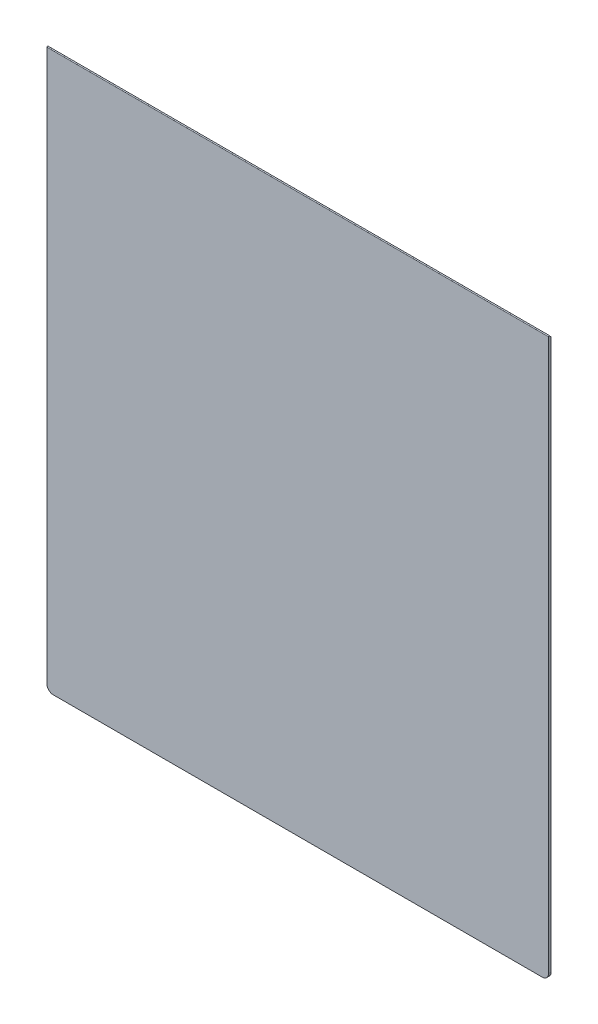
ISO-10303-21;
HEADER;
FILE_DESCRIPTION(('STEP AP214'),'2;1');
FILE_NAME('part.step','',(''),(''),'','','');
FILE_SCHEMA(('AUTOMOTIVE_DESIGN { 1 0 10303 214 1 1 1 1 }'));
ENDSEC;
DATA;
#1=APPLICATION_CONTEXT('core data for automotive mechanical design processes');
#2=APPLICATION_PROTOCOL_DEFINITION('international standard','automotive_design',2000,#1);
#3=PRODUCT_CONTEXT('',#1,'mechanical');
#4=PRODUCT('Part','Part','',(#3));
#5=PRODUCT_RELATED_PRODUCT_CATEGORY('part','',(#4));
#6=PRODUCT_DEFINITION_FORMATION('','',#4);
#7=PRODUCT_DEFINITION_CONTEXT('part definition',#1,'design');
#8=PRODUCT_DEFINITION('design','',#6,#7);
#9=PRODUCT_DEFINITION_SHAPE('','',#8);
#10=(LENGTH_UNIT() NAMED_UNIT(*) SI_UNIT(.MILLI.,.METRE.));
#11=(NAMED_UNIT(*) PLANE_ANGLE_UNIT() SI_UNIT($,.RADIAN.));
#12=(NAMED_UNIT(*) SI_UNIT($,.STERADIAN.) SOLID_ANGLE_UNIT());
#13=UNCERTAINTY_MEASURE_WITH_UNIT(LENGTH_MEASURE(1.E-05),#10,'distance_accuracy_value','');
#14=(GEOMETRIC_REPRESENTATION_CONTEXT(3) GLOBAL_UNCERTAINTY_ASSIGNED_CONTEXT((#13)) GLOBAL_UNIT_ASSIGNED_CONTEXT((#10,
#11,#12)) REPRESENTATION_CONTEXT('',''));
#15=CARTESIAN_POINT('',(0.,0.,0.));
#16=DIRECTION('',(0.,0.,1.));
#17=DIRECTION('',(1.,0.,0.));
#18=AXIS2_PLACEMENT_3D('',#15,#16,#17);
#19=CARTESIAN_POINT('',(357.,-323.191488077077,37.4));
#20=DIRECTION('',(0.,0.,1.));
#21=DIRECTION('',(1.,0.,0.));
#22=AXIS2_PLACEMENT_3D('',#19,#20,#21);
#23=CYLINDRICAL_SURFACE('',#22,5.);
#24=CARTESIAN_POINT('',(357.,-323.191488077077,37.4));
#25=DIRECTION('',(0.,0.,-1.));
#26=DIRECTION('',(-1.,0.,0.));
#27=AXIS2_PLACEMENT_3D('',#24,#25,#26);
#28=CIRCLE('',#27,5.);
#29=CARTESIAN_POINT('',(362.,-323.191488077077,37.4));
#30=VERTEX_POINT('',#29);
#31=CARTESIAN_POINT('',(357.,-328.191488077077,37.4));
#32=VERTEX_POINT('',#31);
#33=EDGE_CURVE('E168',#30,#32,#28,.T.);
#34=ORIENTED_EDGE('',*,*,#33,.F.);
#35=DIRECTION('',(0.,0.,1.));
#36=VECTOR('',#35,1.);
#37=CARTESIAN_POINT('',(362.,-323.191488077077,0.));
#38=LINE('',#37,#36);
#39=CARTESIAN_POINT('',(362.,-323.191488077077,39.4));
#40=VERTEX_POINT('',#39);
#41=EDGE_CURVE('E130',#40,#30,#38,.F.);
#42=ORIENTED_EDGE('',*,*,#41,.F.);
#43=CARTESIAN_POINT('',(357.,-323.191488077077,39.4));
#44=DIRECTION('',(0.,0.,1.));
#45=DIRECTION('',(0.,-1.,0.));
#46=AXIS2_PLACEMENT_3D('',#43,#44,#45);
#47=CIRCLE('',#46,5.);
#48=CARTESIAN_POINT('',(357.,-328.191488077077,39.4));
#49=VERTEX_POINT('',#48);
#50=EDGE_CURVE('E160',#49,#40,#47,.T.);
#51=ORIENTED_EDGE('',*,*,#50,.F.);
#52=DIRECTION('',(0.,0.,1.));
#53=VECTOR('',#52,1.);
#54=CARTESIAN_POINT('',(357.,-328.191488077077,37.4));
#55=LINE('',#54,#53);
#56=EDGE_CURVE('E153',#32,#49,#55,.T.);
#57=ORIENTED_EDGE('',*,*,#56,.F.);
#58=EDGE_LOOP('',(#34,#42,#51,#57));
#59=FACE_BOUND('',#58,.T.);
#60=ADVANCED_FACE('F48',(#59),#23,.T.);
#61=CARTESIAN_POINT('',(853.368633251326,-328.191488077077,37.4));
#62=DIRECTION('',(0.,-1.,0.));
#63=DIRECTION('',(0.,0.,-1.));
#64=AXIS2_PLACEMENT_3D('',#61,#62,#63);
#65=PLANE('',#64);
#66=DIRECTION('',(-1.,0.,0.));
#67=VECTOR('',#66,1.);
#68=CARTESIAN_POINT('',(853.368633251326,-328.191488077077,37.4));
#69=LINE('',#68,#67);
#70=CARTESIAN_POINT('',(-26.9999999999998,-328.191488077077,37.4));
#71=VERTEX_POINT('',#70);
#72=EDGE_CURVE('E133',#32,#71,#69,.T.);
#73=ORIENTED_EDGE('',*,*,#72,.F.);
#74=ORIENTED_EDGE('',*,*,#56,.T.);
#75=DIRECTION('',(-1.,0.,0.));
#76=VECTOR('',#75,1.);
#77=CARTESIAN_POINT('',(853.368633251326,-328.191488077077,39.4));
#78=LINE('',#77,#76);
#79=CARTESIAN_POINT('',(-26.9999999999998,-328.191488077077,39.4));
#80=VERTEX_POINT('',#79);
#81=EDGE_CURVE('E140',#49,#80,#78,.T.);
#82=ORIENTED_EDGE('',*,*,#81,.T.);
#83=DIRECTION('',(0.,0.,1.));
#84=VECTOR('',#83,1.);
#85=CARTESIAN_POINT('',(-27.,-328.191488077077,37.4));
#86=LINE('',#85,#84);
#87=EDGE_CURVE('E150',#80,#71,#86,.F.);
#88=ORIENTED_EDGE('',*,*,#87,.T.);
#89=EDGE_LOOP('',(#73,#74,#82,#88));
#90=FACE_BOUND('',#89,.T.);
#91=ADVANCED_FACE('F215',(#90),#65,.T.);
#92=CARTESIAN_POINT('',(-27.,-323.191488077077,32.4));
#93=DIRECTION('',(0.,0.,1.));
#94=DIRECTION('',(1.,0.,0.));
#95=AXIS2_PLACEMENT_3D('',#92,#93,#94);
#96=CYLINDRICAL_SURFACE('',#95,5.);
#97=CARTESIAN_POINT('',(-27.,-323.191488077077,37.4));
#98=DIRECTION('',(0.,0.,-1.));
#99=DIRECTION('',(-1.,0.,0.));
#100=AXIS2_PLACEMENT_3D('',#97,#98,#99);
#101=CIRCLE('',#100,5.);
#102=CARTESIAN_POINT('',(-32.,-323.191488077077,37.4));
#103=VERTEX_POINT('',#102);
#104=EDGE_CURVE('E165',#71,#103,#101,.T.);
#105=ORIENTED_EDGE('',*,*,#104,.F.);
#106=ORIENTED_EDGE('',*,*,#87,.F.);
#107=CARTESIAN_POINT('',(-27.,-323.191488077077,39.4));
#108=DIRECTION('',(0.,0.,1.));
#109=DIRECTION('',(0.,-1.,0.));
#110=AXIS2_PLACEMENT_3D('',#107,#108,#109);
#111=CIRCLE('',#110,5.);
#112=CARTESIAN_POINT('',(-32.,-323.191488077077,39.4));
#113=VERTEX_POINT('',#112);
#114=EDGE_CURVE('E157',#113,#80,#111,.T.);
#115=ORIENTED_EDGE('',*,*,#114,.F.);
#116=DIRECTION('',(0.,0.,1.));
#117=VECTOR('',#116,1.);
#118=CARTESIAN_POINT('',(-32.,-323.191488077077,32.4));
#119=LINE('',#118,#117);
#120=EDGE_CURVE('E171',#103,#113,#119,.T.);
#121=ORIENTED_EDGE('',*,*,#120,.F.);
#122=EDGE_LOOP('',(#105,#106,#115,#121));
#123=FACE_BOUND('',#122,.T.);
#124=ADVANCED_FACE('F218',(#123),#96,.T.);
#125=CARTESIAN_POINT('',(853.368633251326,-136.211474761492,39.4));
#126=DIRECTION('',(0.,0.,1.));
#127=DIRECTION('',(0.,-1.,0.));
#128=AXIS2_PLACEMENT_3D('',#125,#126,#127);
#129=PLANE('',#128);
#130=DIRECTION('',(0.,1.,0.));
#131=VECTOR('',#130,1.);
#132=CARTESIAN_POINT('',(362.,-136.211474761492,39.4));
#133=LINE('',#132,#131);
#134=CARTESIAN_POINT('',(362.,109.716520072531,39.4));
#135=VERTEX_POINT('',#134);
#136=EDGE_CURVE('E145',#40,#135,#133,.T.);
#137=ORIENTED_EDGE('',*,*,#136,.T.);
#138=DIRECTION('',(1.,0.,0.));
#139=VECTOR('',#138,1.);
#140=CARTESIAN_POINT('',(-32.,109.716520072531,39.4));
#141=LINE('',#140,#139);
#142=CARTESIAN_POINT('',(-32.,109.716520072531,39.4));
#143=VERTEX_POINT('',#142);
#144=EDGE_CURVE('E57',#135,#143,#141,.F.);
#145=ORIENTED_EDGE('',*,*,#144,.T.);
#146=DIRECTION('',(0.,1.,0.));
#147=VECTOR('',#146,1.);
#148=CARTESIAN_POINT('',(-32.,-136.211474761492,39.4));
#149=LINE('',#148,#147);
#150=EDGE_CURVE('E134',#113,#143,#149,.T.);
#151=ORIENTED_EDGE('',*,*,#150,.F.);
#152=ORIENTED_EDGE('',*,*,#114,.T.);
#153=ORIENTED_EDGE('',*,*,#81,.F.);
#154=ORIENTED_EDGE('',*,*,#50,.T.);
#155=EDGE_LOOP('',(#137,#145,#151,#152,#153,#154));
#156=FACE_BOUND('',#155,.T.);
#157=ADVANCED_FACE('F208',(#156),#129,.T.);
#158=CARTESIAN_POINT('',(853.368633251326,-323.191488077077,37.4));
#159=DIRECTION('',(0.,0.,-1.));
#160=DIRECTION('',(-1.,0.,0.));
#161=AXIS2_PLACEMENT_3D('',#158,#159,#160);
#162=PLANE('',#161);
#163=DIRECTION('',(-1.,0.,0.));
#164=VECTOR('',#163,1.);
#165=CARTESIAN_POINT('',(362.,108.687005826572,37.3999999999799));
#166=LINE('',#165,#164);
#167=CARTESIAN_POINT('',(362.,108.687005826572,37.3999999999799));
#168=VERTEX_POINT('',#167);
#169=CARTESIAN_POINT('',(-32.,108.687005826572,37.3999999999799));
#170=VERTEX_POINT('',#169);
#171=EDGE_CURVE('E111',#168,#170,#166,.T.);
#172=ORIENTED_EDGE('',*,*,#171,.F.);
#173=DIRECTION('',(0.,-1.,0.));
#174=VECTOR('',#173,1.);
#175=CARTESIAN_POINT('',(362.,-323.191488077077,37.4));
#176=LINE('',#175,#174);
#177=EDGE_CURVE('E121',#168,#30,#176,.T.);
#178=ORIENTED_EDGE('',*,*,#177,.T.);
#179=ORIENTED_EDGE('',*,*,#33,.T.);
#180=ORIENTED_EDGE('',*,*,#72,.T.);
#181=ORIENTED_EDGE('',*,*,#104,.T.);
#182=DIRECTION('',(0.,-1.,0.));
#183=VECTOR('',#182,1.);
#184=CARTESIAN_POINT('',(-32.,-323.191488077077,37.4));
#185=LINE('',#184,#183);
#186=EDGE_CURVE('E124',#170,#103,#185,.T.);
#187=ORIENTED_EDGE('',*,*,#186,.F.);
#188=EDGE_LOOP('',(#172,#178,#179,#180,#181,#187));
#189=FACE_BOUND('',#188,.T.);
#190=ADVANCED_FACE('F120',(#189),#162,.T.);
#191=CARTESIAN_POINT('',(-32.,113.937005826671,32.4));
#192=DIRECTION('',(-1.,0.,0.));
#193=DIRECTION('',(0.,0.,1.));
#194=AXIS2_PLACEMENT_3D('',#191,#192,#193);
#195=PLANE('',#194);
#196=ORIENTED_EDGE('',*,*,#150,.T.);
#197=CARTESIAN_POINT('',(-32.,109.716520072531,38.9));
#198=DIRECTION('',(-1.,0.,0.));
#199=DIRECTION('',(0.,0.,1.));
#200=AXIS2_PLACEMENT_3D('',#197,#198,#199);
#201=CIRCLE('',#200,0.5);
#202=CARTESIAN_POINT('',(-32.,109.988809476022,38.4806451612935));
#203=VERTEX_POINT('',#202);
#204=EDGE_CURVE('E13',#143,#203,#201,.T.);
#205=ORIENTED_EDGE('',*,*,#204,.T.);
#206=CARTESIAN_POINT('',(-32.,113.937005826671,32.4));
#207=DIRECTION('',(-1.,0.,0.));
#208=DIRECTION('',(0.,0.,1.));
#209=AXIS2_PLACEMENT_3D('',#206,#207,#208);
#210=CIRCLE('',#209,7.25000000005803);
#211=EDGE_CURVE('E126',#170,#203,#210,.T.);
#212=ORIENTED_EDGE('',*,*,#211,.F.);
#213=ORIENTED_EDGE('',*,*,#186,.T.);
#214=ORIENTED_EDGE('',*,*,#120,.T.);
#215=EDGE_LOOP('',(#196,#205,#212,#213,#214));
#216=FACE_BOUND('',#215,.T.);
#217=ADVANCED_FACE('F220',(#216),#195,.T.);
#218=CARTESIAN_POINT('',(362.,0.,0.));
#219=DIRECTION('',(1.,0.,0.));
#220=DIRECTION('',(0.,0.,-1.));
#221=AXIS2_PLACEMENT_3D('',#218,#219,#220);
#222=PLANE('',#221);
#223=CARTESIAN_POINT('',(362.,113.937005826671,32.4));
#224=DIRECTION('',(-1.,0.,0.));
#225=DIRECTION('',(0.,0.,1.));
#226=AXIS2_PLACEMENT_3D('',#223,#224,#225);
#227=CIRCLE('',#226,7.25000000005803);
#228=CARTESIAN_POINT('',(362.,109.988809476022,38.4806451612935));
#229=VERTEX_POINT('',#228);
#230=EDGE_CURVE('E107',#168,#229,#227,.T.);
#231=ORIENTED_EDGE('',*,*,#230,.T.);
#232=CARTESIAN_POINT('',(362.,109.716520072531,38.9));
#233=DIRECTION('',(1.,0.,0.));
#234=DIRECTION('',(0.,0.,-1.));
#235=AXIS2_PLACEMENT_3D('',#232,#233,#234);
#236=CIRCLE('',#235,0.5);
#237=EDGE_CURVE('E71',#229,#135,#236,.T.);
#238=ORIENTED_EDGE('',*,*,#237,.T.);
#239=ORIENTED_EDGE('',*,*,#136,.F.);
#240=ORIENTED_EDGE('',*,*,#41,.T.);
#241=ORIENTED_EDGE('',*,*,#177,.F.);
#242=EDGE_LOOP('',(#231,#238,#239,#240,#241));
#243=FACE_BOUND('',#242,.T.);
#244=ADVANCED_FACE('F128',(#243),#222,.T.);
#245=CARTESIAN_POINT('',(362.,113.937005826671,32.4));
#246=DIRECTION('',(-1.,0.,0.));
#247=DIRECTION('',(0.,0.,1.));
#248=AXIS2_PLACEMENT_3D('',#245,#246,#247);
#249=CYLINDRICAL_SURFACE('',#248,7.25000000005803);
#250=ORIENTED_EDGE('',*,*,#211,.T.);
#251=DIRECTION('',(-1.,0.,0.));
#252=VECTOR('',#251,1.);
#253=CARTESIAN_POINT('',(362.,109.988809476022,38.4806451612935));
#254=LINE('',#253,#252);
#255=EDGE_CURVE('E114',#203,#229,#254,.F.);
#256=ORIENTED_EDGE('',*,*,#255,.T.);
#257=ORIENTED_EDGE('',*,*,#230,.F.);
#258=ORIENTED_EDGE('',*,*,#171,.T.);
#259=EDGE_LOOP('',(#250,#256,#257,#258));
#260=FACE_BOUND('',#259,.T.);
#261=ADVANCED_FACE('F110',(#260),#249,.F.);
#262=CARTESIAN_POINT('',(362.,109.716520072531,38.9));
#263=DIRECTION('',(-1.,0.,0.));
#264=DIRECTION('',(0.,0.,1.));
#265=AXIS2_PLACEMENT_3D('',#262,#263,#264);
#266=CYLINDRICAL_SURFACE('',#265,0.5);
#267=ORIENTED_EDGE('',*,*,#204,.F.);
#268=ORIENTED_EDGE('',*,*,#144,.F.);
#269=ORIENTED_EDGE('',*,*,#237,.F.);
#270=ORIENTED_EDGE('',*,*,#255,.F.);
#271=EDGE_LOOP('',(#267,#268,#269,#270));
#272=FACE_BOUND('',#271,.T.);
#273=ADVANCED_FACE('F50',(#272),#266,.T.);
#274=CLOSED_SHELL('',(#60,#91,#124,#157,#190,#217,#244,#261,#273));
#275=MANIFOLD_SOLID_BREP('B2',#274);
#276=ADVANCED_BREP_SHAPE_REPRESENTATION('',(#18,#275),#14);
#277=SHAPE_DEFINITION_REPRESENTATION(#9,#276);
ENDSEC;
END-ISO-10303-21;
